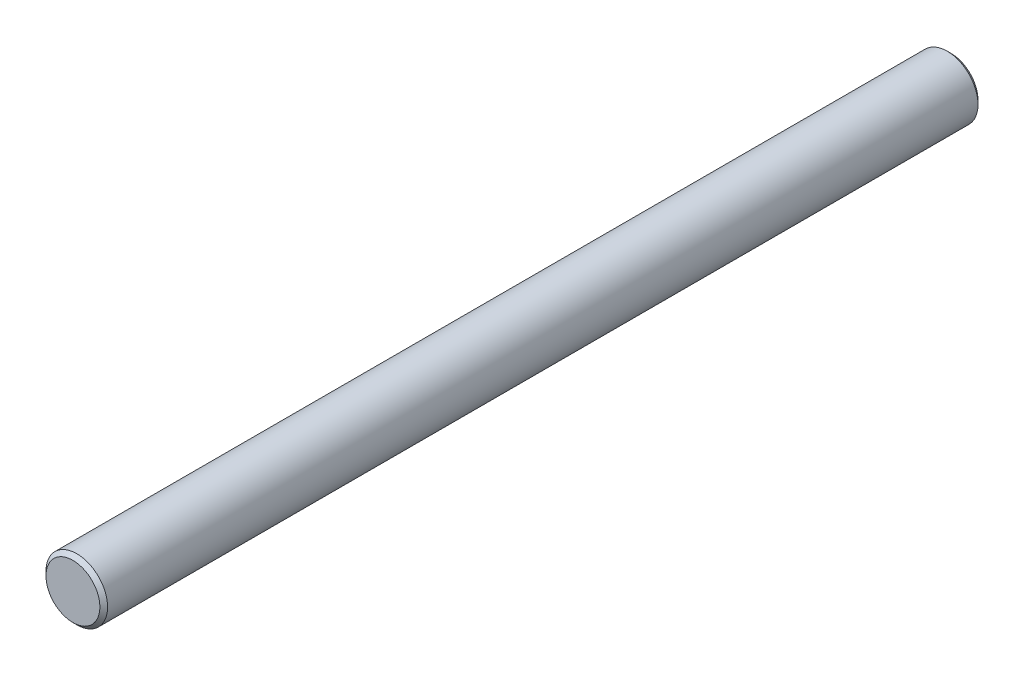
ISO-10303-21;
HEADER;
FILE_DESCRIPTION(('STEP AP214'),'2;1');
FILE_NAME('part.step','',(''),(''),'','','');
FILE_SCHEMA(('AUTOMOTIVE_DESIGN { 1 0 10303 214 1 1 1 1 }'));
ENDSEC;
DATA;
#1=APPLICATION_CONTEXT('core data for automotive mechanical design processes');
#2=APPLICATION_PROTOCOL_DEFINITION('international standard','automotive_design',2000,#1);
#3=PRODUCT_CONTEXT('',#1,'mechanical');
#4=PRODUCT('Part','Part','',(#3));
#5=PRODUCT_RELATED_PRODUCT_CATEGORY('part','',(#4));
#6=PRODUCT_DEFINITION_FORMATION('','',#4);
#7=PRODUCT_DEFINITION_CONTEXT('part definition',#1,'design');
#8=PRODUCT_DEFINITION('design','',#6,#7);
#9=PRODUCT_DEFINITION_SHAPE('','',#8);
#10=(LENGTH_UNIT() NAMED_UNIT(*) SI_UNIT(.MILLI.,.METRE.));
#11=(NAMED_UNIT(*) PLANE_ANGLE_UNIT() SI_UNIT($,.RADIAN.));
#12=(NAMED_UNIT(*) SI_UNIT($,.STERADIAN.) SOLID_ANGLE_UNIT());
#13=UNCERTAINTY_MEASURE_WITH_UNIT(LENGTH_MEASURE(1.E-05),#10,'distance_accuracy_value','');
#14=(GEOMETRIC_REPRESENTATION_CONTEXT(3) GLOBAL_UNCERTAINTY_ASSIGNED_CONTEXT((#13)) GLOBAL_UNIT_ASSIGNED_CONTEXT((#10,
#11,#12)) REPRESENTATION_CONTEXT('',''));
#15=CARTESIAN_POINT('',(0.,0.,0.));
#16=DIRECTION('',(0.,0.,1.));
#17=DIRECTION('',(1.,0.,0.));
#18=AXIS2_PLACEMENT_3D('',#15,#16,#17);
#19=CARTESIAN_POINT('',(1.1048299992914,270.012836124968,57.));
#20=DIRECTION('',(0.,0.,1.));
#21=DIRECTION('',(0.147583746543714,-0.989049562841075,0.));
#22=AXIS2_PLACEMENT_3D('',#19,#20,#21);
#23=PLANE('',#22);
#24=CARTESIAN_POINT('',(1.1048299992914,270.012836124968,57.));
#25=DIRECTION('',(0.,0.,-1.));
#26=DIRECTION('',(0.147583746543714,-0.989049562841075,0.));
#27=AXIS2_PLACEMENT_3D('',#24,#25,#26);
#28=CIRCLE('',#27,3.5);
#29=CARTESIAN_POINT('',(0.588286886388401,273.474509594912,57.));
#30=VERTEX_POINT('',#29);
#31=EDGE_CURVE('E58',#30,#30,#28,.T.);
#32=ORIENTED_EDGE('',*,*,#31,.F.);
#33=EDGE_LOOP('',(#32));
#34=FACE_BOUND('',#33,.T.);
#35=ADVANCED_FACE('F47',(#34),#23,.T.);
#36=CARTESIAN_POINT('',(1.1048299992914,270.012836124968,56.75));
#37=DIRECTION('',(0.,0.,-1.));
#38=DIRECTION('',(0.147583746543714,-0.989049562841075,0.));
#39=AXIS2_PLACEMENT_3D('',#36,#37,#38);
#40=CONICAL_SURFACE('',#39,3.75,0.78539816339745);
#41=ORIENTED_EDGE('',*,*,#31,.T.);
#42=DIRECTION('',(-0.104357467973977,0.699363652814516,-0.707106781186546));
#43=VECTOR('',#42,1.);
#44=CARTESIAN_POINT('',(0.551390949752484,273.721771985622,56.75));
#45=LINE('',#44,#43);
#46=CARTESIAN_POINT('',(0.514495013116512,273.969034376332,56.5));
#47=VERTEX_POINT('',#46);
#48=EDGE_CURVE('E11',#30,#47,#45,.T.);
#49=ORIENTED_EDGE('',*,*,#48,.T.);
#50=CARTESIAN_POINT('',(1.1048299992914,270.012836124968,56.5));
#51=DIRECTION('',(0.,0.,1.));
#52=DIRECTION('',(0.147583746543714,-0.989049562841075,0.));
#53=AXIS2_PLACEMENT_3D('',#50,#51,#52);
#54=CIRCLE('',#53,4.);
#55=EDGE_CURVE('E89',#47,#47,#54,.T.);
#56=ORIENTED_EDGE('',*,*,#55,.T.);
#57=ORIENTED_EDGE('',*,*,#48,.F.);
#58=EDGE_LOOP('',(#41,#49,#56,#57));
#59=FACE_BOUND('',#58,.T.);
#60=ADVANCED_FACE('F105',(#59),#40,.T.);
#61=CARTESIAN_POINT('',(1.1048299992914,270.012836124968,-57.));
#62=DIRECTION('',(0.,0.,1.));
#63=DIRECTION('',(0.147583746543714,-0.989049562841075,0.));
#64=AXIS2_PLACEMENT_3D('',#61,#62,#63);
#65=PLANE('',#64);
#66=CARTESIAN_POINT('',(1.1048299992914,270.012836124968,-57.));
#67=DIRECTION('',(0.,0.,1.));
#68=DIRECTION('',(0.147583746543714,-0.989049562841075,0.));
#69=AXIS2_PLACEMENT_3D('',#66,#67,#68);
#70=CIRCLE('',#69,3.5);
#71=CARTESIAN_POINT('',(0.588286886388401,273.474509594912,-57.));
#72=VERTEX_POINT('',#71);
#73=EDGE_CURVE('E51',#72,#72,#70,.T.);
#74=ORIENTED_EDGE('',*,*,#73,.F.);
#75=EDGE_LOOP('',(#74));
#76=FACE_BOUND('',#75,.T.);
#77=ADVANCED_FACE('F112',(#76),#65,.F.);
#78=CARTESIAN_POINT('',(1.1048299992914,270.012836124968,0.));
#79=DIRECTION('',(0.,0.,1.));
#80=DIRECTION('',(0.147583746543714,-0.989049562841075,0.));
#81=AXIS2_PLACEMENT_3D('',#78,#79,#80);
#82=CYLINDRICAL_SURFACE('',#81,4.);
#83=ORIENTED_EDGE('',*,*,#55,.F.);
#84=DIRECTION('',(0.,0.,-1.));
#85=VECTOR('',#84,1.);
#86=CARTESIAN_POINT('',(0.514495013116512,273.969034376332,0.));
#87=LINE('',#86,#85);
#88=CARTESIAN_POINT('',(0.514495013116512,273.969034376332,-56.5));
#89=VERTEX_POINT('',#88);
#90=EDGE_CURVE('E87',#47,#89,#87,.T.);
#91=ORIENTED_EDGE('',*,*,#90,.T.);
#92=CARTESIAN_POINT('',(1.1048299992914,270.012836124968,-56.5));
#93=DIRECTION('',(0.,0.,-1.));
#94=DIRECTION('',(0.147583746543714,-0.989049562841075,0.));
#95=AXIS2_PLACEMENT_3D('',#92,#93,#94);
#96=CIRCLE('',#95,4.);
#97=EDGE_CURVE('E88',#89,#89,#96,.T.);
#98=ORIENTED_EDGE('',*,*,#97,.F.);
#99=ORIENTED_EDGE('',*,*,#90,.F.);
#100=EDGE_LOOP('',(#83,#91,#98,#99));
#101=FACE_BOUND('',#100,.T.);
#102=ADVANCED_FACE('F49',(#101),#82,.T.);
#103=CARTESIAN_POINT('',(1.1048299992914,270.012836124968,-56.75));
#104=DIRECTION('',(0.,0.,1.));
#105=DIRECTION('',(0.147583746543714,-0.989049562841075,0.));
#106=AXIS2_PLACEMENT_3D('',#103,#104,#105);
#107=CONICAL_SURFACE('',#106,3.75,0.78539816339745);
#108=ORIENTED_EDGE('',*,*,#73,.T.);
#109=DIRECTION('',(-0.104357467973977,0.699363652814516,0.707106781186546));
#110=VECTOR('',#109,1.);
#111=CARTESIAN_POINT('',(0.551390949752484,273.721771985622,-56.75));
#112=LINE('',#111,#110);
#113=EDGE_CURVE('E79',#72,#89,#112,.T.);
#114=ORIENTED_EDGE('',*,*,#113,.T.);
#115=ORIENTED_EDGE('',*,*,#97,.T.);
#116=ORIENTED_EDGE('',*,*,#113,.F.);
#117=EDGE_LOOP('',(#108,#114,#115,#116));
#118=FACE_BOUND('',#117,.T.);
#119=ADVANCED_FACE('F92',(#118),#107,.T.);
#120=CLOSED_SHELL('',(#35,#60,#77,#102,#119));
#121=MANIFOLD_SOLID_BREP('B2',#120);
#122=ADVANCED_BREP_SHAPE_REPRESENTATION('',(#18,#121),#14);
#123=SHAPE_DEFINITION_REPRESENTATION(#9,#122);
ENDSEC;
END-ISO-10303-21;
